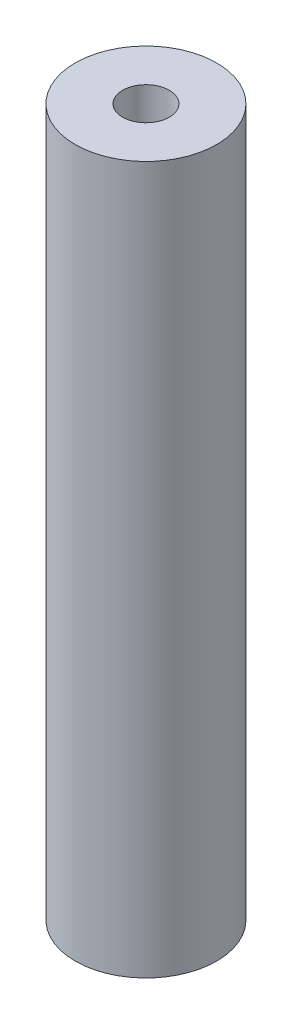
ISO-10303-21;
HEADER;
FILE_DESCRIPTION(('STEP AP214'),'2;1');
FILE_NAME('part.step','',(''),(''),'','','');
FILE_SCHEMA(('AUTOMOTIVE_DESIGN { 1 0 10303 214 1 1 1 1 }'));
ENDSEC;
DATA;
#1=APPLICATION_CONTEXT('core data for automotive mechanical design processes');
#2=APPLICATION_PROTOCOL_DEFINITION('international standard','automotive_design',2000,#1);
#3=PRODUCT_CONTEXT('',#1,'mechanical');
#4=PRODUCT('Part','Part','',(#3));
#5=PRODUCT_RELATED_PRODUCT_CATEGORY('part','',(#4));
#6=PRODUCT_DEFINITION_FORMATION('','',#4);
#7=PRODUCT_DEFINITION_CONTEXT('part definition',#1,'design');
#8=PRODUCT_DEFINITION('design','',#6,#7);
#9=PRODUCT_DEFINITION_SHAPE('','',#8);
#10=(LENGTH_UNIT() NAMED_UNIT(*) SI_UNIT(.MILLI.,.METRE.));
#11=(NAMED_UNIT(*) PLANE_ANGLE_UNIT() SI_UNIT($,.RADIAN.));
#12=(NAMED_UNIT(*) SI_UNIT($,.STERADIAN.) SOLID_ANGLE_UNIT());
#13=UNCERTAINTY_MEASURE_WITH_UNIT(LENGTH_MEASURE(1.E-05),#10,'distance_accuracy_value','');
#14=(GEOMETRIC_REPRESENTATION_CONTEXT(3) GLOBAL_UNCERTAINTY_ASSIGNED_CONTEXT((#13)) GLOBAL_UNIT_ASSIGNED_CONTEXT((#10,
#11,#12)) REPRESENTATION_CONTEXT('',''));
#15=CARTESIAN_POINT('',(0.,0.,0.));
#16=DIRECTION('',(0.,0.,1.));
#17=DIRECTION('',(1.,0.,0.));
#18=AXIS2_PLACEMENT_3D('',#15,#16,#17);
#19=CARTESIAN_POINT('',(0.,25.,0.));
#20=DIRECTION('',(0.,-1.,0.));
#21=DIRECTION('',(0.,0.,-1.));
#22=AXIS2_PLACEMENT_3D('',#19,#20,#21);
#23=CYLINDRICAL_SURFACE('',#22,5.);
#24=CARTESIAN_POINT('',(0.,25.,0.));
#25=DIRECTION('',(0.,1.,0.));
#26=DIRECTION('',(0.,0.,1.));
#27=AXIS2_PLACEMENT_3D('',#24,#25,#26);
#28=CIRCLE('',#27,5.);
#29=CARTESIAN_POINT('',(0.,25.,5.));
#30=VERTEX_POINT('',#29);
#31=EDGE_CURVE('E13',#30,#30,#28,.T.);
#32=ORIENTED_EDGE('',*,*,#31,.F.);
#33=EDGE_LOOP('',(#32));
#34=FACE_BOUND('',#33,.T.);
#35=CARTESIAN_POINT('',(0.,-25.,0.));
#36=DIRECTION('',(0.,1.,0.));
#37=DIRECTION('',(0.,0.,1.));
#38=AXIS2_PLACEMENT_3D('',#35,#36,#37);
#39=CIRCLE('',#38,5.);
#40=CARTESIAN_POINT('',(0.,-25.,5.));
#41=VERTEX_POINT('',#40);
#42=EDGE_CURVE('E55',#41,#41,#39,.T.);
#43=ORIENTED_EDGE('',*,*,#42,.T.);
#44=EDGE_LOOP('',(#43));
#45=FACE_BOUND('',#44,.T.);
#46=ADVANCED_FACE('F52',(#34,#45),#23,.T.);
#47=CARTESIAN_POINT('',(0.,25.,0.));
#48=DIRECTION('',(0.,1.,0.));
#49=DIRECTION('',(0.,0.,1.));
#50=AXIS2_PLACEMENT_3D('',#47,#48,#49);
#51=PLANE('',#50);
#52=CARTESIAN_POINT('',(0.,25.,0.));
#53=DIRECTION('',(0.,1.,0.));
#54=DIRECTION('',(0.,0.,1.));
#55=AXIS2_PLACEMENT_3D('',#52,#53,#54);
#56=CIRCLE('',#55,1.64999999999999);
#57=CARTESIAN_POINT('',(0.,25.,1.64999999999999));
#58=VERTEX_POINT('',#57);
#59=EDGE_CURVE('E78',#58,#58,#56,.T.);
#60=ORIENTED_EDGE('',*,*,#59,.F.);
#61=EDGE_LOOP('',(#60));
#62=FACE_BOUND('',#61,.T.);
#63=ORIENTED_EDGE('',*,*,#31,.T.);
#64=EDGE_LOOP('',(#63));
#65=FACE_BOUND('',#64,.T.);
#66=ADVANCED_FACE('F100',(#62,#65),#51,.T.);
#67=CARTESIAN_POINT('',(0.,-25.,0.));
#68=DIRECTION('',(0.,1.,0.));
#69=DIRECTION('',(0.,0.,1.));
#70=AXIS2_PLACEMENT_3D('',#67,#68,#69);
#71=PLANE('',#70);
#72=CARTESIAN_POINT('',(0.,-25.,0.));
#73=DIRECTION('',(0.,-1.,0.));
#74=DIRECTION('',(0.,0.,-1.));
#75=AXIS2_PLACEMENT_3D('',#72,#73,#74);
#76=CIRCLE('',#75,1.64999999999999);
#77=CARTESIAN_POINT('',(0.,-25.,-1.64999999999999));
#78=VERTEX_POINT('',#77);
#79=EDGE_CURVE('E79',#78,#78,#76,.T.);
#80=ORIENTED_EDGE('',*,*,#79,.F.);
#81=EDGE_LOOP('',(#80));
#82=FACE_BOUND('',#81,.T.);
#83=ORIENTED_EDGE('',*,*,#42,.F.);
#84=EDGE_LOOP('',(#83));
#85=FACE_BOUND('',#84,.T.);
#86=ADVANCED_FACE('F97',(#82,#85),#71,.F.);
#87=CARTESIAN_POINT('',(0.,13.5,0.));
#88=DIRECTION('',(0.,1.,0.));
#89=DIRECTION('',(0.,0.,1.));
#90=AXIS2_PLACEMENT_3D('',#87,#88,#89);
#91=CONICAL_SURFACE('',#90,1.64999999999999,1.02974425867665);
#92=CARTESIAN_POINT('',(0.,12.5085799786045,0.));
#93=VERTEX_POINT('',#92);
#94=VERTEX_LOOP('',#93);
#95=FACE_BOUND('',#94,.T.);
#96=CARTESIAN_POINT('',(0.,13.5,0.));
#97=DIRECTION('',(0.,1.,0.));
#98=DIRECTION('',(0.,0.,1.));
#99=AXIS2_PLACEMENT_3D('',#96,#97,#98);
#100=CIRCLE('',#99,1.64999999999999);
#101=CARTESIAN_POINT('',(0.,13.5,1.64999999999999));
#102=VERTEX_POINT('',#101);
#103=EDGE_CURVE('E84',#102,#102,#100,.T.);
#104=ORIENTED_EDGE('',*,*,#103,.T.);
#105=EDGE_LOOP('',(#104));
#106=FACE_BOUND('',#105,.T.);
#107=ADVANCED_FACE('F99',(#95,#106),#91,.F.);
#108=CARTESIAN_POINT('',(0.,25.,0.));
#109=DIRECTION('',(0.,1.,0.));
#110=DIRECTION('',(0.,0.,1.));
#111=AXIS2_PLACEMENT_3D('',#108,#109,#110);
#112=CYLINDRICAL_SURFACE('',#111,1.64999999999999);
#113=ORIENTED_EDGE('',*,*,#103,.F.);
#114=EDGE_LOOP('',(#113));
#115=FACE_BOUND('',#114,.T.);
#116=ORIENTED_EDGE('',*,*,#59,.T.);
#117=EDGE_LOOP('',(#116));
#118=FACE_BOUND('',#117,.T.);
#119=ADVANCED_FACE('F71',(#115,#118),#112,.F.);
#120=CARTESIAN_POINT('',(0.,-13.5,0.));
#121=DIRECTION('',(0.,-1.,0.));
#122=DIRECTION('',(0.,0.,-1.));
#123=AXIS2_PLACEMENT_3D('',#120,#121,#122);
#124=CONICAL_SURFACE('',#123,1.64999999999999,1.02974425867665);
#125=CARTESIAN_POINT('',(0.,-12.5085799786045,0.));
#126=VERTEX_POINT('',#125);
#127=VERTEX_LOOP('',#126);
#128=FACE_BOUND('',#127,.T.);
#129=CARTESIAN_POINT('',(0.,-13.5,0.));
#130=DIRECTION('',(0.,-1.,0.));
#131=DIRECTION('',(0.,0.,-1.));
#132=AXIS2_PLACEMENT_3D('',#129,#130,#131);
#133=CIRCLE('',#132,1.64999999999999);
#134=CARTESIAN_POINT('',(0.,-13.5,-1.64999999999999));
#135=VERTEX_POINT('',#134);
#136=EDGE_CURVE('E75',#135,#135,#133,.T.);
#137=ORIENTED_EDGE('',*,*,#136,.T.);
#138=EDGE_LOOP('',(#137));
#139=FACE_BOUND('',#138,.T.);
#140=ADVANCED_FACE('F67',(#128,#139),#124,.F.);
#141=CARTESIAN_POINT('',(0.,-25.,0.));
#142=DIRECTION('',(0.,-1.,0.));
#143=DIRECTION('',(0.,0.,-1.));
#144=AXIS2_PLACEMENT_3D('',#141,#142,#143);
#145=CYLINDRICAL_SURFACE('',#144,1.64999999999999);
#146=ORIENTED_EDGE('',*,*,#136,.F.);
#147=EDGE_LOOP('',(#146));
#148=FACE_BOUND('',#147,.T.);
#149=ORIENTED_EDGE('',*,*,#79,.T.);
#150=EDGE_LOOP('',(#149));
#151=FACE_BOUND('',#150,.T.);
#152=ADVANCED_FACE('F70',(#148,#151),#145,.F.);
#153=CLOSED_SHELL('',(#46,#66,#86,#107,#119,#140,#152));
#154=MANIFOLD_SOLID_BREP('B2',#153);
#155=ADVANCED_BREP_SHAPE_REPRESENTATION('',(#18,#154),#14);
#156=SHAPE_DEFINITION_REPRESENTATION(#9,#155);
ENDSEC;
END-ISO-10303-21;
